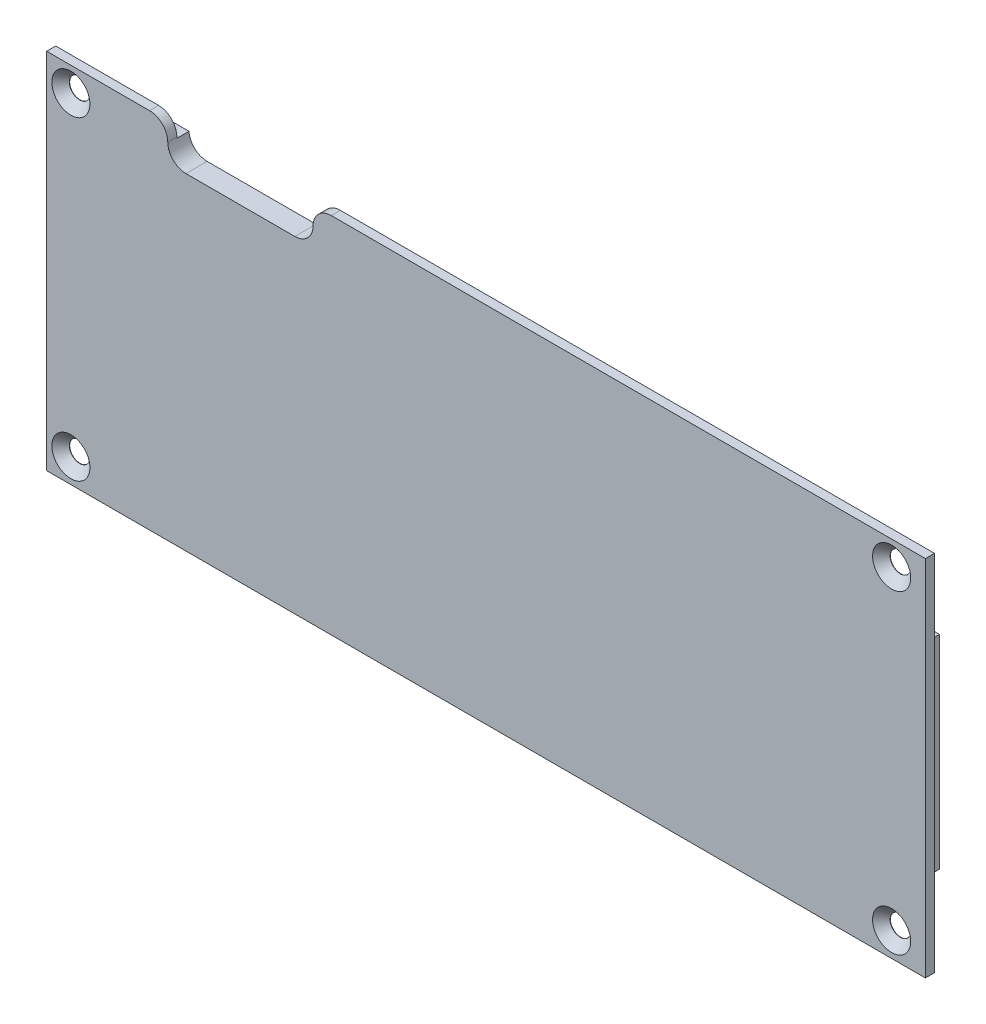
ISO-10303-21;
HEADER;
FILE_DESCRIPTION(('STEP AP214'),'2;1');
FILE_NAME('part.step','',(''),(''),'','','');
FILE_SCHEMA(('AUTOMOTIVE_DESIGN { 1 0 10303 214 1 1 1 1 }'));
ENDSEC;
DATA;
#1=APPLICATION_CONTEXT('core data for automotive mechanical design processes');
#2=APPLICATION_PROTOCOL_DEFINITION('international standard','automotive_design',2000,#1);
#3=PRODUCT_CONTEXT('',#1,'mechanical');
#4=PRODUCT('Part','Part','',(#3));
#5=PRODUCT_RELATED_PRODUCT_CATEGORY('part','',(#4));
#6=PRODUCT_DEFINITION_FORMATION('','',#4);
#7=PRODUCT_DEFINITION_CONTEXT('part definition',#1,'design');
#8=PRODUCT_DEFINITION('design','',#6,#7);
#9=PRODUCT_DEFINITION_SHAPE('','',#8);
#10=(LENGTH_UNIT() NAMED_UNIT(*) SI_UNIT(.MILLI.,.METRE.));
#11=(NAMED_UNIT(*) PLANE_ANGLE_UNIT() SI_UNIT($,.RADIAN.));
#12=(NAMED_UNIT(*) SI_UNIT($,.STERADIAN.) SOLID_ANGLE_UNIT());
#13=UNCERTAINTY_MEASURE_WITH_UNIT(LENGTH_MEASURE(1.E-05),#10,'distance_accuracy_value','');
#14=(GEOMETRIC_REPRESENTATION_CONTEXT(3) GLOBAL_UNCERTAINTY_ASSIGNED_CONTEXT((#13)) GLOBAL_UNIT_ASSIGNED_CONTEXT((#10,
#11,#12)) REPRESENTATION_CONTEXT('',''));
#15=CARTESIAN_POINT('',(0.,0.,0.));
#16=DIRECTION('',(0.,0.,1.));
#17=DIRECTION('',(1.,0.,0.));
#18=AXIS2_PLACEMENT_3D('',#15,#16,#17);
#19=CARTESIAN_POINT('',(72.574098,30.,1.5));
#20=DIRECTION('',(0.,-1.,0.));
#21=DIRECTION('',(1.,0.,0.));
#22=AXIS2_PLACEMENT_3D('',#19,#20,#21);
#23=PLANE('',#22);
#24=DIRECTION('',(-1.,0.,0.));
#25=VECTOR('',#24,1.);
#26=CARTESIAN_POINT('',(72.574098,30.,1.5));
#27=LINE('',#26,#25);
#28=CARTESIAN_POINT('',(-55.574098,30.,1.5));
#29=VERTEX_POINT('',#28);
#30=CARTESIAN_POINT('',(-72.574098,30.,1.5));
#31=VERTEX_POINT('',#30);
#32=EDGE_CURVE('E216',#29,#31,#27,.T.);
#33=ORIENTED_EDGE('',*,*,#32,.F.);
#34=DIRECTION('',(0.,0.,1.));
#35=VECTOR('',#34,1.);
#36=CARTESIAN_POINT('',(-55.574098,30.,1.5));
#37=LINE('',#36,#35);
#38=CARTESIAN_POINT('',(-55.574098,30.,0.));
#39=VERTEX_POINT('',#38);
#40=EDGE_CURVE('E253',#29,#39,#37,.F.);
#41=ORIENTED_EDGE('',*,*,#40,.T.);
#42=DIRECTION('',(-1.,0.,0.));
#43=VECTOR('',#42,1.);
#44=CARTESIAN_POINT('',(72.574098,30.,0.));
#45=LINE('',#44,#43);
#46=CARTESIAN_POINT('',(-72.574098,30.,0.));
#47=VERTEX_POINT('',#46);
#48=EDGE_CURVE('E224',#39,#47,#45,.T.);
#49=ORIENTED_EDGE('',*,*,#48,.T.);
#50=DIRECTION('',(0.,0.,-1.));
#51=VECTOR('',#50,1.);
#52=CARTESIAN_POINT('',(-72.574098,30.,1.5));
#53=LINE('',#52,#51);
#54=EDGE_CURVE('E219',#31,#47,#53,.T.);
#55=ORIENTED_EDGE('',*,*,#54,.F.);
#56=EDGE_LOOP('',(#33,#41,#49,#55));
#57=FACE_BOUND('',#56,.T.);
#58=ADVANCED_FACE('F37',(#57),#23,.F.);
#59=CARTESIAN_POINT('',(61.374098,26.8,-2.));
#60=DIRECTION('',(0.,-1.,0.));
#61=DIRECTION('',(0.,0.,-1.));
#62=AXIS2_PLACEMENT_3D('',#59,#60,#61);
#63=PLANE('',#62);
#64=DIRECTION('',(1.,0.,0.));
#65=VECTOR('',#64,1.);
#66=CARTESIAN_POINT('',(61.374098,26.8,0.));
#67=LINE('',#66,#65);
#68=CARTESIAN_POINT('',(-61.374098,26.8,0.));
#69=VERTEX_POINT('',#68);
#70=CARTESIAN_POINT('',(-52.5674239094191,26.8,0.));
#71=VERTEX_POINT('',#70);
#72=EDGE_CURVE('E60',#69,#71,#67,.T.);
#73=ORIENTED_EDGE('',*,*,#72,.T.);
#74=DIRECTION('',(0.,0.,-1.));
#75=VECTOR('',#74,1.);
#76=CARTESIAN_POINT('',(-52.5674239094192,26.8,0.));
#77=LINE('',#76,#75);
#78=CARTESIAN_POINT('',(-52.5674239094191,26.8,-2.));
#79=VERTEX_POINT('',#78);
#80=EDGE_CURVE('E46',#71,#79,#77,.T.);
#81=ORIENTED_EDGE('',*,*,#80,.T.);
#82=DIRECTION('',(1.,0.,0.));
#83=VECTOR('',#82,1.);
#84=CARTESIAN_POINT('',(61.374098,26.8,-2.));
#85=LINE('',#84,#83);
#86=CARTESIAN_POINT('',(-61.374098,26.8,-2.));
#87=VERTEX_POINT('',#86);
#88=EDGE_CURVE('E53',#87,#79,#85,.T.);
#89=ORIENTED_EDGE('',*,*,#88,.F.);
#90=DIRECTION('',(0.,0.,1.));
#91=VECTOR('',#90,1.);
#92=CARTESIAN_POINT('',(-61.374098,26.8,-2.));
#93=LINE('',#92,#91);
#94=EDGE_CURVE('E394',#87,#69,#93,.T.);
#95=ORIENTED_EDGE('',*,*,#94,.T.);
#96=EDGE_LOOP('',(#73,#81,#89,#95));
#97=FACE_BOUND('',#96,.T.);
#98=ADVANCED_FACE('F410',(#97),#63,.F.);
#99=CARTESIAN_POINT('',(0.,0.,0.));
#100=DIRECTION('',(0.,0.,1.));
#101=DIRECTION('',(1.,0.,0.));
#102=AXIS2_PLACEMENT_3D('',#99,#100,#101);
#103=PLANE('',#102);
#104=CARTESIAN_POINT('',(-68.574098,26.,0.));
#105=DIRECTION('',(0.,0.,1.));
#106=DIRECTION('',(1.,0.,0.));
#107=AXIS2_PLACEMENT_3D('',#104,#105,#106);
#108=CIRCLE('',#107,1.69999999999999);
#109=CARTESIAN_POINT('',(-66.874098,26.,0.));
#110=VERTEX_POINT('',#109);
#111=EDGE_CURVE('E329',#110,#110,#108,.T.);
#112=ORIENTED_EDGE('',*,*,#111,.T.);
#113=EDGE_LOOP('',(#112));
#114=FACE_BOUND('',#113,.T.);
#115=CARTESIAN_POINT('',(-68.574098,-26.,0.));
#116=DIRECTION('',(0.,0.,1.));
#117=DIRECTION('',(1.,0.,0.));
#118=AXIS2_PLACEMENT_3D('',#115,#116,#117);
#119=CIRCLE('',#118,1.69999999999999);
#120=CARTESIAN_POINT('',(-66.874098,-26.,0.));
#121=VERTEX_POINT('',#120);
#122=EDGE_CURVE('E338',#121,#121,#119,.T.);
#123=ORIENTED_EDGE('',*,*,#122,.T.);
#124=EDGE_LOOP('',(#123));
#125=FACE_BOUND('',#124,.T.);
#126=CARTESIAN_POINT('',(66.99808,26.,0.));
#127=DIRECTION('',(0.,0.,1.));
#128=DIRECTION('',(1.,0.,0.));
#129=AXIS2_PLACEMENT_3D('',#126,#127,#128);
#130=CIRCLE('',#129,1.69999999999999);
#131=CARTESIAN_POINT('',(68.69808,26.,0.));
#132=VERTEX_POINT('',#131);
#133=EDGE_CURVE('E347',#132,#132,#130,.T.);
#134=ORIENTED_EDGE('',*,*,#133,.T.);
#135=EDGE_LOOP('',(#134));
#136=FACE_BOUND('',#135,.T.);
#137=CARTESIAN_POINT('',(66.99808,-26.,0.));
#138=DIRECTION('',(0.,0.,1.));
#139=DIRECTION('',(1.,0.,0.));
#140=AXIS2_PLACEMENT_3D('',#137,#138,#139);
#141=CIRCLE('',#140,1.69999999999999);
#142=CARTESIAN_POINT('',(68.69808,-26.,0.));
#143=VERTEX_POINT('',#142);
#144=EDGE_CURVE('E356',#143,#143,#141,.T.);
#145=ORIENTED_EDGE('',*,*,#144,.T.);
#146=EDGE_LOOP('',(#145));
#147=FACE_BOUND('',#146,.T.);
#148=CARTESIAN_POINT('',(-28.5807720905808,26.8,0.));
#149=VERTEX_POINT('',#148);
#150=CARTESIAN_POINT('',(61.374098,26.8,0.));
#151=VERTEX_POINT('',#150);
#152=EDGE_CURVE('E380',#149,#151,#67,.T.);
#153=ORIENTED_EDGE('',*,*,#152,.F.);
#154=CARTESIAN_POINT('',(-31.574098,27.,0.));
#155=DIRECTION('',(0.,0.,1.));
#156=DIRECTION('',(1.,0.,0.));
#157=AXIS2_PLACEMENT_3D('',#154,#155,#156);
#158=CIRCLE('',#157,3.);
#159=CARTESIAN_POINT('',(-28.574098,27.,0.));
#160=VERTEX_POINT('',#159);
#161=EDGE_CURVE('E264',#149,#160,#158,.T.);
#162=ORIENTED_EDGE('',*,*,#161,.T.);
#163=CARTESIAN_POINT('',(-25.574098,27.,0.));
#164=DIRECTION('',(0.,0.,1.));
#165=DIRECTION('',(1.,0.,0.));
#166=AXIS2_PLACEMENT_3D('',#163,#164,#165);
#167=CIRCLE('',#166,3.);
#168=CARTESIAN_POINT('',(-25.574098,30.,0.));
#169=VERTEX_POINT('',#168);
#170=EDGE_CURVE('E247',#160,#169,#167,.F.);
#171=ORIENTED_EDGE('',*,*,#170,.T.);
#172=CARTESIAN_POINT('',(72.574098,30.,0.));
#173=VERTEX_POINT('',#172);
#174=EDGE_CURVE('E212',#173,#169,#45,.T.);
#175=ORIENTED_EDGE('',*,*,#174,.F.);
#176=DIRECTION('',(0.,1.,0.));
#177=VECTOR('',#176,1.);
#178=CARTESIAN_POINT('',(72.574098,-30.,0.));
#179=LINE('',#178,#177);
#180=CARTESIAN_POINT('',(72.574098,-30.,0.));
#181=VERTEX_POINT('',#180);
#182=EDGE_CURVE('E222',#181,#173,#179,.T.);
#183=ORIENTED_EDGE('',*,*,#182,.F.);
#184=DIRECTION('',(1.,0.,0.));
#185=VECTOR('',#184,1.);
#186=CARTESIAN_POINT('',(72.574098,-30.,0.));
#187=LINE('',#186,#185);
#188=CARTESIAN_POINT('',(-72.574098,-30.,0.));
#189=VERTEX_POINT('',#188);
#190=EDGE_CURVE('E202',#189,#181,#187,.T.);
#191=ORIENTED_EDGE('',*,*,#190,.F.);
#192=DIRECTION('',(0.,-1.,0.));
#193=VECTOR('',#192,1.);
#194=CARTESIAN_POINT('',(-72.574098,-30.,0.));
#195=LINE('',#194,#193);
#196=EDGE_CURVE('E199',#47,#189,#195,.T.);
#197=ORIENTED_EDGE('',*,*,#196,.F.);
#198=ORIENTED_EDGE('',*,*,#48,.F.);
#199=CARTESIAN_POINT('',(-55.574098,27.,0.));
#200=DIRECTION('',(0.,0.,1.));
#201=DIRECTION('',(1.,0.,0.));
#202=AXIS2_PLACEMENT_3D('',#199,#200,#201);
#203=CIRCLE('',#202,3.);
#204=CARTESIAN_POINT('',(-52.574098,27.,0.));
#205=VERTEX_POINT('',#204);
#206=EDGE_CURVE('E245',#39,#205,#203,.F.);
#207=ORIENTED_EDGE('',*,*,#206,.T.);
#208=CARTESIAN_POINT('',(-49.574098,27.,0.));
#209=DIRECTION('',(0.,0.,1.));
#210=DIRECTION('',(1.,0.,0.));
#211=AXIS2_PLACEMENT_3D('',#208,#209,#210);
#212=CIRCLE('',#211,3.);
#213=EDGE_CURVE('E268',#205,#71,#212,.T.);
#214=ORIENTED_EDGE('',*,*,#213,.T.);
#215=ORIENTED_EDGE('',*,*,#72,.F.);
#216=CARTESIAN_POINT('',(-71.374098,26.8,0.));
#217=DIRECTION('',(0.,0.,1.));
#218=DIRECTION('',(-1.,0.,0.));
#219=AXIS2_PLACEMENT_3D('',#216,#217,#218);
#220=CIRCLE('',#219,10.);
#221=CARTESIAN_POINT('',(-71.374098,16.8,0.));
#222=VERTEX_POINT('',#221);
#223=EDGE_CURVE('E378',#222,#69,#220,.T.);
#224=ORIENTED_EDGE('',*,*,#223,.F.);
#225=DIRECTION('',(0.,1.,0.));
#226=VECTOR('',#225,1.);
#227=CARTESIAN_POINT('',(-71.374098,16.8,0.));
#228=LINE('',#227,#226);
#229=CARTESIAN_POINT('',(-71.374098,-16.8,0.));
#230=VERTEX_POINT('',#229);
#231=EDGE_CURVE('E375',#230,#222,#228,.T.);
#232=ORIENTED_EDGE('',*,*,#231,.F.);
#233=CARTESIAN_POINT('',(-71.374098,-26.8,0.));
#234=DIRECTION('',(0.,0.,1.));
#235=DIRECTION('',(-1.,0.,0.));
#236=AXIS2_PLACEMENT_3D('',#233,#234,#235);
#237=CIRCLE('',#236,10.);
#238=CARTESIAN_POINT('',(-61.374098,-26.8,0.));
#239=VERTEX_POINT('',#238);
#240=EDGE_CURVE('E372',#239,#230,#237,.T.);
#241=ORIENTED_EDGE('',*,*,#240,.F.);
#242=DIRECTION('',(-1.,0.,0.));
#243=VECTOR('',#242,1.);
#244=CARTESIAN_POINT('',(-61.374098,-26.8,0.));
#245=LINE('',#244,#243);
#246=CARTESIAN_POINT('',(61.374098,-26.8,0.));
#247=VERTEX_POINT('',#246);
#248=EDGE_CURVE('E370',#247,#239,#245,.T.);
#249=ORIENTED_EDGE('',*,*,#248,.F.);
#250=CARTESIAN_POINT('',(71.374098,-26.8,0.));
#251=DIRECTION('',(0.,0.,1.));
#252=DIRECTION('',(1.,0.,0.));
#253=AXIS2_PLACEMENT_3D('',#250,#251,#252);
#254=CIRCLE('',#253,10.);
#255=CARTESIAN_POINT('',(71.374098,-16.8,0.));
#256=VERTEX_POINT('',#255);
#257=EDGE_CURVE('E198',#256,#247,#254,.T.);
#258=ORIENTED_EDGE('',*,*,#257,.F.);
#259=DIRECTION('',(0.,-1.,0.));
#260=VECTOR('',#259,1.);
#261=CARTESIAN_POINT('',(71.374098,-16.8,0.));
#262=LINE('',#261,#260);
#263=CARTESIAN_POINT('',(71.374098,16.8,0.));
#264=VERTEX_POINT('',#263);
#265=EDGE_CURVE('E195',#264,#256,#262,.T.);
#266=ORIENTED_EDGE('',*,*,#265,.F.);
#267=CARTESIAN_POINT('',(71.374098,26.8,0.));
#268=DIRECTION('',(0.,0.,1.));
#269=DIRECTION('',(-1.,0.,0.));
#270=AXIS2_PLACEMENT_3D('',#267,#268,#269);
#271=CIRCLE('',#270,10.);
#272=EDGE_CURVE('E382',#151,#264,#271,.T.);
#273=ORIENTED_EDGE('',*,*,#272,.F.);
#274=EDGE_LOOP('',(#153,#162,#171,#175,#183,#191,#197,#198,#207,#214,#215,#224,#232,#241,#249,
#258,#266,#273));
#275=FACE_BOUND('',#274,.T.);
#276=ADVANCED_FACE('F292',(#114,#125,#136,#147,#275),#103,.F.);
#277=CARTESIAN_POINT('',(-72.574098,-30.,1.5));
#278=DIRECTION('',(1.,0.,0.));
#279=DIRECTION('',(0.,0.,-1.));
#280=AXIS2_PLACEMENT_3D('',#277,#278,#279);
#281=PLANE('',#280);
#282=ORIENTED_EDGE('',*,*,#196,.T.);
#283=DIRECTION('',(0.,0.,-1.));
#284=VECTOR('',#283,1.);
#285=CARTESIAN_POINT('',(-72.574098,-30.,1.5));
#286=LINE('',#285,#284);
#287=CARTESIAN_POINT('',(-72.574098,-30.,1.5));
#288=VERTEX_POINT('',#287);
#289=EDGE_CURVE('E235',#288,#189,#286,.T.);
#290=ORIENTED_EDGE('',*,*,#289,.F.);
#291=DIRECTION('',(0.,-1.,0.));
#292=VECTOR('',#291,1.);
#293=CARTESIAN_POINT('',(-72.574098,-30.,1.5));
#294=LINE('',#293,#292);
#295=EDGE_CURVE('E208',#31,#288,#294,.T.);
#296=ORIENTED_EDGE('',*,*,#295,.F.);
#297=ORIENTED_EDGE('',*,*,#54,.T.);
#298=EDGE_LOOP('',(#282,#290,#296,#297));
#299=FACE_BOUND('',#298,.T.);
#300=ADVANCED_FACE('F301',(#299),#281,.F.);
#301=CARTESIAN_POINT('',(72.574098,-30.,1.5));
#302=DIRECTION('',(0.,1.,0.));
#303=DIRECTION('',(-1.,0.,0.));
#304=AXIS2_PLACEMENT_3D('',#301,#302,#303);
#305=PLANE('',#304);
#306=ORIENTED_EDGE('',*,*,#190,.T.);
#307=DIRECTION('',(0.,0.,-1.));
#308=VECTOR('',#307,1.);
#309=CARTESIAN_POINT('',(72.574098,-30.,1.5));
#310=LINE('',#309,#308);
#311=CARTESIAN_POINT('',(72.574098,-30.,1.5));
#312=VERTEX_POINT('',#311);
#313=EDGE_CURVE('E232',#312,#181,#310,.T.);
#314=ORIENTED_EDGE('',*,*,#313,.F.);
#315=DIRECTION('',(1.,0.,0.));
#316=VECTOR('',#315,1.);
#317=CARTESIAN_POINT('',(72.574098,-30.,1.5));
#318=LINE('',#317,#316);
#319=EDGE_CURVE('E211',#288,#312,#318,.T.);
#320=ORIENTED_EDGE('',*,*,#319,.F.);
#321=ORIENTED_EDGE('',*,*,#289,.T.);
#322=EDGE_LOOP('',(#306,#314,#320,#321));
#323=FACE_BOUND('',#322,.T.);
#324=ADVANCED_FACE('F448',(#323),#305,.F.);
#325=CARTESIAN_POINT('',(72.574098,-30.,1.5));
#326=DIRECTION('',(-1.,0.,0.));
#327=DIRECTION('',(0.,-1.,0.));
#328=AXIS2_PLACEMENT_3D('',#325,#326,#327);
#329=PLANE('',#328);
#330=ORIENTED_EDGE('',*,*,#182,.T.);
#331=DIRECTION('',(0.,0.,-1.));
#332=VECTOR('',#331,1.);
#333=CARTESIAN_POINT('',(72.574098,30.,1.5));
#334=LINE('',#333,#332);
#335=CARTESIAN_POINT('',(72.574098,30.,1.5));
#336=VERTEX_POINT('',#335);
#337=EDGE_CURVE('E229',#336,#173,#334,.T.);
#338=ORIENTED_EDGE('',*,*,#337,.F.);
#339=DIRECTION('',(0.,1.,0.));
#340=VECTOR('',#339,1.);
#341=CARTESIAN_POINT('',(72.574098,-30.,1.5));
#342=LINE('',#341,#340);
#343=EDGE_CURVE('E214',#312,#336,#342,.T.);
#344=ORIENTED_EDGE('',*,*,#343,.F.);
#345=ORIENTED_EDGE('',*,*,#313,.T.);
#346=EDGE_LOOP('',(#330,#338,#344,#345));
#347=FACE_BOUND('',#346,.T.);
#348=ADVANCED_FACE('F445',(#347),#329,.F.);
#349=ORIENTED_EDGE('',*,*,#174,.T.);
#350=DIRECTION('',(0.,0.,1.));
#351=VECTOR('',#350,1.);
#352=CARTESIAN_POINT('',(-25.574098,30.,1.5));
#353=LINE('',#352,#351);
#354=CARTESIAN_POINT('',(-25.574098,30.,1.5));
#355=VERTEX_POINT('',#354);
#356=EDGE_CURVE('E238',#169,#355,#353,.T.);
#357=ORIENTED_EDGE('',*,*,#356,.T.);
#358=EDGE_CURVE('E217',#336,#355,#27,.T.);
#359=ORIENTED_EDGE('',*,*,#358,.F.);
#360=ORIENTED_EDGE('',*,*,#337,.T.);
#361=EDGE_LOOP('',(#349,#357,#359,#360));
#362=FACE_BOUND('',#361,.T.);
#363=ADVANCED_FACE('F421',(#362),#23,.F.);
#364=CARTESIAN_POINT('',(0.,0.,1.5));
#365=DIRECTION('',(0.,0.,1.));
#366=DIRECTION('',(1.,0.,0.));
#367=AXIS2_PLACEMENT_3D('',#364,#365,#366);
#368=PLANE('',#367);
#369=ORIENTED_EDGE('',*,*,#358,.T.);
#370=CARTESIAN_POINT('',(-25.574098,27.,1.5));
#371=DIRECTION('',(0.,0.,1.));
#372=DIRECTION('',(1.,0.,0.));
#373=AXIS2_PLACEMENT_3D('',#370,#371,#372);
#374=CIRCLE('',#373,3.);
#375=CARTESIAN_POINT('',(-28.574098,27.,1.5));
#376=VERTEX_POINT('',#375);
#377=EDGE_CURVE('E243',#355,#376,#374,.T.);
#378=ORIENTED_EDGE('',*,*,#377,.T.);
#379=CARTESIAN_POINT('',(-31.574098,27.,1.5));
#380=DIRECTION('',(0.,0.,1.));
#381=DIRECTION('',(1.,0.,0.));
#382=AXIS2_PLACEMENT_3D('',#379,#380,#381);
#383=CIRCLE('',#382,3.);
#384=CARTESIAN_POINT('',(-31.574098,24.,1.5));
#385=VERTEX_POINT('',#384);
#386=EDGE_CURVE('E256',#376,#385,#383,.F.);
#387=ORIENTED_EDGE('',*,*,#386,.T.);
#388=DIRECTION('',(1.,0.,0.));
#389=VECTOR('',#388,1.);
#390=CARTESIAN_POINT('',(-52.574098,24.,1.5));
#391=LINE('',#390,#389);
#392=CARTESIAN_POINT('',(-49.574098,24.,1.5));
#393=VERTEX_POINT('',#392);
#394=EDGE_CURVE('E272',#393,#385,#391,.T.);
#395=ORIENTED_EDGE('',*,*,#394,.F.);
#396=CARTESIAN_POINT('',(-49.574098,27.,1.5));
#397=DIRECTION('',(0.,0.,1.));
#398=DIRECTION('',(1.,0.,0.));
#399=AXIS2_PLACEMENT_3D('',#396,#397,#398);
#400=CIRCLE('',#399,3.);
#401=CARTESIAN_POINT('',(-52.574098,27.,1.5));
#402=VERTEX_POINT('',#401);
#403=EDGE_CURVE('E266',#393,#402,#400,.F.);
#404=ORIENTED_EDGE('',*,*,#403,.T.);
#405=CARTESIAN_POINT('',(-55.574098,27.,1.5));
#406=DIRECTION('',(0.,0.,1.));
#407=DIRECTION('',(1.,0.,0.));
#408=AXIS2_PLACEMENT_3D('',#405,#406,#407);
#409=CIRCLE('',#408,3.);
#410=EDGE_CURVE('E241',#402,#29,#409,.T.);
#411=ORIENTED_EDGE('',*,*,#410,.T.);
#412=ORIENTED_EDGE('',*,*,#32,.T.);
#413=ORIENTED_EDGE('',*,*,#295,.T.);
#414=ORIENTED_EDGE('',*,*,#319,.T.);
#415=ORIENTED_EDGE('',*,*,#343,.T.);
#416=EDGE_LOOP('',(#369,#378,#387,#395,#404,#411,#412,#413,#414,#415));
#417=FACE_BOUND('',#416,.T.);
#418=CARTESIAN_POINT('',(-68.574098,26.,1.5));
#419=DIRECTION('',(0.,0.,1.));
#420=DIRECTION('',(1.,0.,0.));
#421=AXIS2_PLACEMENT_3D('',#418,#419,#420);
#422=CIRCLE('',#421,3.15);
#423=CARTESIAN_POINT('',(-65.424098,26.,1.5));
#424=VERTEX_POINT('',#423);
#425=EDGE_CURVE('E321',#424,#424,#422,.T.);
#426=ORIENTED_EDGE('',*,*,#425,.F.);
#427=EDGE_LOOP('',(#426));
#428=FACE_BOUND('',#427,.T.);
#429=CARTESIAN_POINT('',(-68.574098,-26.,1.5));
#430=DIRECTION('',(0.,0.,1.));
#431=DIRECTION('',(1.,0.,0.));
#432=AXIS2_PLACEMENT_3D('',#429,#430,#431);
#433=CIRCLE('',#432,3.15);
#434=CARTESIAN_POINT('',(-65.424098,-26.,1.5));
#435=VERTEX_POINT('',#434);
#436=EDGE_CURVE('E332',#435,#435,#433,.T.);
#437=ORIENTED_EDGE('',*,*,#436,.F.);
#438=EDGE_LOOP('',(#437));
#439=FACE_BOUND('',#438,.T.);
#440=CARTESIAN_POINT('',(66.99808,26.,1.5));
#441=DIRECTION('',(0.,0.,1.));
#442=DIRECTION('',(1.,0.,0.));
#443=AXIS2_PLACEMENT_3D('',#440,#441,#442);
#444=CIRCLE('',#443,3.15);
#445=CARTESIAN_POINT('',(70.14808,26.,1.5));
#446=VERTEX_POINT('',#445);
#447=EDGE_CURVE('E341',#446,#446,#444,.T.);
#448=ORIENTED_EDGE('',*,*,#447,.F.);
#449=EDGE_LOOP('',(#448));
#450=FACE_BOUND('',#449,.T.);
#451=CARTESIAN_POINT('',(66.99808,-26.,1.5));
#452=DIRECTION('',(0.,0.,1.));
#453=DIRECTION('',(1.,0.,0.));
#454=AXIS2_PLACEMENT_3D('',#451,#452,#453);
#455=CIRCLE('',#454,3.15);
#456=CARTESIAN_POINT('',(70.14808,-26.,1.5));
#457=VERTEX_POINT('',#456);
#458=EDGE_CURVE('E350',#457,#457,#455,.T.);
#459=ORIENTED_EDGE('',*,*,#458,.F.);
#460=EDGE_LOOP('',(#459));
#461=FACE_BOUND('',#460,.T.);
#462=ADVANCED_FACE('F304',(#417,#428,#439,#450,#461),#368,.T.);
#463=CARTESIAN_POINT('',(71.374098,-26.8,-2.));
#464=DIRECTION('',(0.,0.,1.));
#465=DIRECTION('',(1.,0.,0.));
#466=AXIS2_PLACEMENT_3D('',#463,#464,#465);
#467=CYLINDRICAL_SURFACE('',#466,10.);
#468=ORIENTED_EDGE('',*,*,#257,.T.);
#469=DIRECTION('',(0.,0.,1.));
#470=VECTOR('',#469,1.);
#471=CARTESIAN_POINT('',(61.374098,-26.8,-2.));
#472=LINE('',#471,#470);
#473=CARTESIAN_POINT('',(61.374098,-26.8,-2.));
#474=VERTEX_POINT('',#473);
#475=EDGE_CURVE('E180',#474,#247,#472,.T.);
#476=ORIENTED_EDGE('',*,*,#475,.F.);
#477=CARTESIAN_POINT('',(71.374098,-26.8,-2.));
#478=DIRECTION('',(0.,0.,1.));
#479=DIRECTION('',(1.,0.,0.));
#480=AXIS2_PLACEMENT_3D('',#477,#478,#479);
#481=CIRCLE('',#480,10.);
#482=CARTESIAN_POINT('',(71.374098,-16.8,-2.));
#483=VERTEX_POINT('',#482);
#484=EDGE_CURVE('E186',#483,#474,#481,.T.);
#485=ORIENTED_EDGE('',*,*,#484,.F.);
#486=DIRECTION('',(0.,0.,1.));
#487=VECTOR('',#486,1.);
#488=CARTESIAN_POINT('',(71.374098,-16.8,-2.));
#489=LINE('',#488,#487);
#490=EDGE_CURVE('E368',#483,#256,#489,.T.);
#491=ORIENTED_EDGE('',*,*,#490,.T.);
#492=EDGE_LOOP('',(#468,#476,#485,#491));
#493=FACE_BOUND('',#492,.T.);
#494=ADVANCED_FACE('F197',(#493),#467,.F.);
#495=CARTESIAN_POINT('',(-61.374098,-26.8,-2.));
#496=DIRECTION('',(0.,1.,0.));
#497=DIRECTION('',(0.,0.,1.));
#498=AXIS2_PLACEMENT_3D('',#495,#496,#497);
#499=PLANE('',#498);
#500=ORIENTED_EDGE('',*,*,#248,.T.);
#501=DIRECTION('',(0.,0.,1.));
#502=VECTOR('',#501,1.);
#503=CARTESIAN_POINT('',(-61.374098,-26.8,-2.));
#504=LINE('',#503,#502);
#505=CARTESIAN_POINT('',(-61.374098,-26.8,-2.));
#506=VERTEX_POINT('',#505);
#507=EDGE_CURVE('E183',#506,#239,#504,.T.);
#508=ORIENTED_EDGE('',*,*,#507,.F.);
#509=DIRECTION('',(-1.,0.,0.));
#510=VECTOR('',#509,1.);
#511=CARTESIAN_POINT('',(-61.374098,-26.8,-2.));
#512=LINE('',#511,#510);
#513=EDGE_CURVE('E175',#474,#506,#512,.T.);
#514=ORIENTED_EDGE('',*,*,#513,.F.);
#515=ORIENTED_EDGE('',*,*,#475,.T.);
#516=EDGE_LOOP('',(#500,#508,#514,#515));
#517=FACE_BOUND('',#516,.T.);
#518=ADVANCED_FACE('F178',(#517),#499,.F.);
#519=CARTESIAN_POINT('',(-71.374098,-26.8,-2.));
#520=DIRECTION('',(0.,0.,1.));
#521=DIRECTION('',(1.,0.,0.));
#522=AXIS2_PLACEMENT_3D('',#519,#520,#521);
#523=CYLINDRICAL_SURFACE('',#522,10.);
#524=ORIENTED_EDGE('',*,*,#240,.T.);
#525=DIRECTION('',(0.,0.,1.));
#526=VECTOR('',#525,1.);
#527=CARTESIAN_POINT('',(-71.374098,-16.8,-2.));
#528=LINE('',#527,#526);
#529=CARTESIAN_POINT('',(-71.374098,-16.8,-2.));
#530=VERTEX_POINT('',#529);
#531=EDGE_CURVE('E204',#530,#230,#528,.T.);
#532=ORIENTED_EDGE('',*,*,#531,.F.);
#533=CARTESIAN_POINT('',(-71.374098,-26.8,-2.));
#534=DIRECTION('',(0.,0.,1.));
#535=DIRECTION('',(-1.,0.,0.));
#536=AXIS2_PLACEMENT_3D('',#533,#534,#535);
#537=CIRCLE('',#536,10.);
#538=EDGE_CURVE('E185',#506,#530,#537,.T.);
#539=ORIENTED_EDGE('',*,*,#538,.F.);
#540=ORIENTED_EDGE('',*,*,#507,.T.);
#541=EDGE_LOOP('',(#524,#532,#539,#540));
#542=FACE_BOUND('',#541,.T.);
#543=ADVANCED_FACE('F405',(#542),#523,.F.);
#544=CARTESIAN_POINT('',(-71.374098,16.8,-2.));
#545=DIRECTION('',(1.,0.,0.));
#546=DIRECTION('',(0.,0.,-1.));
#547=AXIS2_PLACEMENT_3D('',#544,#545,#546);
#548=PLANE('',#547);
#549=ORIENTED_EDGE('',*,*,#231,.T.);
#550=DIRECTION('',(0.,0.,1.));
#551=VECTOR('',#550,1.);
#552=CARTESIAN_POINT('',(-71.374098,16.8,-2.));
#553=LINE('',#552,#551);
#554=CARTESIAN_POINT('',(-71.374098,16.8,-2.));
#555=VERTEX_POINT('',#554);
#556=EDGE_CURVE('E396',#555,#222,#553,.T.);
#557=ORIENTED_EDGE('',*,*,#556,.F.);
#558=DIRECTION('',(0.,1.,0.));
#559=VECTOR('',#558,1.);
#560=CARTESIAN_POINT('',(-71.374098,16.8,-2.));
#561=LINE('',#560,#559);
#562=EDGE_CURVE('E360',#530,#555,#561,.T.);
#563=ORIENTED_EDGE('',*,*,#562,.F.);
#564=ORIENTED_EDGE('',*,*,#531,.T.);
#565=EDGE_LOOP('',(#549,#557,#563,#564));
#566=FACE_BOUND('',#565,.T.);
#567=ADVANCED_FACE('F402',(#566),#548,.F.);
#568=CARTESIAN_POINT('',(-71.374098,26.8,-2.));
#569=DIRECTION('',(0.,0.,1.));
#570=DIRECTION('',(1.,0.,0.));
#571=AXIS2_PLACEMENT_3D('',#568,#569,#570);
#572=CYLINDRICAL_SURFACE('',#571,10.);
#573=ORIENTED_EDGE('',*,*,#223,.T.);
#574=ORIENTED_EDGE('',*,*,#94,.F.);
#575=CARTESIAN_POINT('',(-71.374098,26.8,-2.));
#576=DIRECTION('',(0.,0.,1.));
#577=DIRECTION('',(-1.,0.,0.));
#578=AXIS2_PLACEMENT_3D('',#575,#576,#577);
#579=CIRCLE('',#578,10.);
#580=EDGE_CURVE('E362',#555,#87,#579,.T.);
#581=ORIENTED_EDGE('',*,*,#580,.F.);
#582=ORIENTED_EDGE('',*,*,#556,.T.);
#583=EDGE_LOOP('',(#573,#574,#581,#582));
#584=FACE_BOUND('',#583,.T.);
#585=ADVANCED_FACE('F408',(#584),#572,.F.);
#586=CARTESIAN_POINT('',(-28.5807720905808,26.8,-2.));
#587=VERTEX_POINT('',#586);
#588=CARTESIAN_POINT('',(61.374098,26.8,-2.));
#589=VERTEX_POINT('',#588);
#590=EDGE_CURVE('E319',#587,#589,#85,.T.);
#591=ORIENTED_EDGE('',*,*,#590,.F.);
#592=DIRECTION('',(0.,0.,-1.));
#593=VECTOR('',#592,1.);
#594=CARTESIAN_POINT('',(-28.5807720905809,26.8,-2.));
#595=LINE('',#594,#593);
#596=EDGE_CURVE('E261',#587,#149,#595,.F.);
#597=ORIENTED_EDGE('',*,*,#596,.T.);
#598=ORIENTED_EDGE('',*,*,#152,.T.);
#599=DIRECTION('',(0.,0.,1.));
#600=VECTOR('',#599,1.);
#601=CARTESIAN_POINT('',(61.374098,26.8,-2.));
#602=LINE('',#601,#600);
#603=EDGE_CURVE('E391',#589,#151,#602,.T.);
#604=ORIENTED_EDGE('',*,*,#603,.F.);
#605=EDGE_LOOP('',(#591,#597,#598,#604));
#606=FACE_BOUND('',#605,.T.);
#607=ADVANCED_FACE('F413',(#606),#63,.F.);
#608=CARTESIAN_POINT('',(71.374098,26.8,-2.));
#609=DIRECTION('',(0.,0.,1.));
#610=DIRECTION('',(1.,0.,0.));
#611=AXIS2_PLACEMENT_3D('',#608,#609,#610);
#612=CYLINDRICAL_SURFACE('',#611,10.);
#613=ORIENTED_EDGE('',*,*,#272,.T.);
#614=DIRECTION('',(0.,0.,1.));
#615=VECTOR('',#614,1.);
#616=CARTESIAN_POINT('',(71.374098,16.8,-2.));
#617=LINE('',#616,#615);
#618=CARTESIAN_POINT('',(71.374098,16.8,-2.));
#619=VERTEX_POINT('',#618);
#620=EDGE_CURVE('E388',#619,#264,#617,.T.);
#621=ORIENTED_EDGE('',*,*,#620,.F.);
#622=CARTESIAN_POINT('',(71.374098,26.8,-2.));
#623=DIRECTION('',(0.,0.,1.));
#624=DIRECTION('',(-1.,0.,0.));
#625=AXIS2_PLACEMENT_3D('',#622,#623,#624);
#626=CIRCLE('',#625,10.);
#627=EDGE_CURVE('E365',#589,#619,#626,.T.);
#628=ORIENTED_EDGE('',*,*,#627,.F.);
#629=ORIENTED_EDGE('',*,*,#603,.T.);
#630=EDGE_LOOP('',(#613,#621,#628,#629));
#631=FACE_BOUND('',#630,.T.);
#632=ADVANCED_FACE('F425',(#631),#612,.F.);
#633=CARTESIAN_POINT('',(71.374098,-16.8,-2.));
#634=DIRECTION('',(-1.,0.,0.));
#635=DIRECTION('',(0.,0.,1.));
#636=AXIS2_PLACEMENT_3D('',#633,#634,#635);
#637=PLANE('',#636);
#638=ORIENTED_EDGE('',*,*,#265,.T.);
#639=ORIENTED_EDGE('',*,*,#490,.F.);
#640=DIRECTION('',(0.,-1.,0.));
#641=VECTOR('',#640,1.);
#642=CARTESIAN_POINT('',(71.374098,-16.8,-2.));
#643=LINE('',#642,#641);
#644=EDGE_CURVE('E191',#619,#483,#643,.T.);
#645=ORIENTED_EDGE('',*,*,#644,.F.);
#646=ORIENTED_EDGE('',*,*,#620,.T.);
#647=EDGE_LOOP('',(#638,#639,#645,#646));
#648=FACE_BOUND('',#647,.T.);
#649=ADVANCED_FACE('F431',(#648),#637,.F.);
#650=CARTESIAN_POINT('',(71.374098,-26.8,-2.));
#651=DIRECTION('',(0.,0.,1.));
#652=DIRECTION('',(1.,0.,0.));
#653=AXIS2_PLACEMENT_3D('',#650,#651,#652);
#654=PLANE('',#653);
#655=ORIENTED_EDGE('',*,*,#88,.T.);
#656=CARTESIAN_POINT('',(-49.574098,27.,-2.));
#657=DIRECTION('',(0.,0.,1.));
#658=DIRECTION('',(1.,0.,0.));
#659=AXIS2_PLACEMENT_3D('',#656,#657,#658);
#660=CIRCLE('',#659,3.);
#661=CARTESIAN_POINT('',(-49.574098,24.,-2.));
#662=VERTEX_POINT('',#661);
#663=EDGE_CURVE('E11',#79,#662,#660,.T.);
#664=ORIENTED_EDGE('',*,*,#663,.T.);
#665=DIRECTION('',(1.,0.,0.));
#666=VECTOR('',#665,1.);
#667=CARTESIAN_POINT('',(-52.574098,24.,-2.));
#668=LINE('',#667,#666);
#669=CARTESIAN_POINT('',(-31.574098,24.,-2.));
#670=VERTEX_POINT('',#669);
#671=EDGE_CURVE('E277',#662,#670,#668,.T.);
#672=ORIENTED_EDGE('',*,*,#671,.T.);
#673=CARTESIAN_POINT('',(-31.574098,27.,-2.));
#674=DIRECTION('',(0.,0.,1.));
#675=DIRECTION('',(1.,0.,0.));
#676=AXIS2_PLACEMENT_3D('',#673,#674,#675);
#677=CIRCLE('',#676,3.);
#678=EDGE_CURVE('E258',#670,#587,#677,.T.);
#679=ORIENTED_EDGE('',*,*,#678,.T.);
#680=ORIENTED_EDGE('',*,*,#590,.T.);
#681=ORIENTED_EDGE('',*,*,#627,.T.);
#682=ORIENTED_EDGE('',*,*,#644,.T.);
#683=ORIENTED_EDGE('',*,*,#484,.T.);
#684=ORIENTED_EDGE('',*,*,#513,.T.);
#685=ORIENTED_EDGE('',*,*,#538,.T.);
#686=ORIENTED_EDGE('',*,*,#562,.T.);
#687=ORIENTED_EDGE('',*,*,#580,.T.);
#688=EDGE_LOOP('',(#655,#664,#672,#679,#680,#681,#682,#683,#684,#685,#686,#687));
#689=FACE_BOUND('',#688,.T.);
#690=ADVANCED_FACE('F189',(#689),#654,.F.);
#691=CARTESIAN_POINT('',(66.99808,-26.,1.5));
#692=DIRECTION('',(0.,0.,1.));
#693=DIRECTION('',(1.,0.,0.));
#694=AXIS2_PLACEMENT_3D('',#691,#692,#693);
#695=CYLINDRICAL_SURFACE('',#694,1.69999999999999);
#696=ORIENTED_EDGE('',*,*,#144,.F.);
#697=EDGE_LOOP('',(#696));
#698=FACE_BOUND('',#697,.T.);
#699=CARTESIAN_POINT('',(66.99808,-26.,0.0500000000000006));
#700=DIRECTION('',(0.,0.,1.));
#701=DIRECTION('',(1.,0.,0.));
#702=AXIS2_PLACEMENT_3D('',#699,#700,#701);
#703=CIRCLE('',#702,1.69999999999999);
#704=CARTESIAN_POINT('',(68.69808,-26.,0.0500000000000006));
#705=VERTEX_POINT('',#704);
#706=EDGE_CURVE('E353',#705,#705,#703,.T.);
#707=ORIENTED_EDGE('',*,*,#706,.T.);
#708=EDGE_LOOP('',(#707));
#709=FACE_BOUND('',#708,.T.);
#710=ADVANCED_FACE('F538',(#698,#709),#695,.F.);
#711=CARTESIAN_POINT('',(66.99808,-26.,1.5));
#712=DIRECTION('',(0.,0.,1.));
#713=DIRECTION('',(1.,0.,0.));
#714=AXIS2_PLACEMENT_3D('',#711,#712,#713);
#715=CONICAL_SURFACE('',#714,3.15,0.78539816339745);
#716=ORIENTED_EDGE('',*,*,#706,.F.);
#717=EDGE_LOOP('',(#716));
#718=FACE_BOUND('',#717,.T.);
#719=ORIENTED_EDGE('',*,*,#458,.T.);
#720=EDGE_LOOP('',(#719));
#721=FACE_BOUND('',#720,.T.);
#722=ADVANCED_FACE('F530',(#718,#721),#715,.F.);
#723=CARTESIAN_POINT('',(66.99808,26.,1.5));
#724=DIRECTION('',(0.,0.,1.));
#725=DIRECTION('',(1.,0.,0.));
#726=AXIS2_PLACEMENT_3D('',#723,#724,#725);
#727=CYLINDRICAL_SURFACE('',#726,1.69999999999999);
#728=ORIENTED_EDGE('',*,*,#133,.F.);
#729=EDGE_LOOP('',(#728));
#730=FACE_BOUND('',#729,.T.);
#731=CARTESIAN_POINT('',(66.99808,26.,0.0500000000000006));
#732=DIRECTION('',(0.,0.,1.));
#733=DIRECTION('',(1.,0.,0.));
#734=AXIS2_PLACEMENT_3D('',#731,#732,#733);
#735=CIRCLE('',#734,1.69999999999999);
#736=CARTESIAN_POINT('',(68.69808,26.,0.0500000000000006));
#737=VERTEX_POINT('',#736);
#738=EDGE_CURVE('E344',#737,#737,#735,.T.);
#739=ORIENTED_EDGE('',*,*,#738,.T.);
#740=EDGE_LOOP('',(#739));
#741=FACE_BOUND('',#740,.T.);
#742=ADVANCED_FACE('F522',(#730,#741),#727,.F.);
#743=CARTESIAN_POINT('',(66.99808,26.,1.5));
#744=DIRECTION('',(0.,0.,1.));
#745=DIRECTION('',(1.,0.,0.));
#746=AXIS2_PLACEMENT_3D('',#743,#744,#745);
#747=CONICAL_SURFACE('',#746,3.15,0.78539816339745);
#748=ORIENTED_EDGE('',*,*,#738,.F.);
#749=EDGE_LOOP('',(#748));
#750=FACE_BOUND('',#749,.T.);
#751=ORIENTED_EDGE('',*,*,#447,.T.);
#752=EDGE_LOOP('',(#751));
#753=FACE_BOUND('',#752,.T.);
#754=ADVANCED_FACE('F514',(#750,#753),#747,.F.);
#755=CARTESIAN_POINT('',(-68.574098,-26.,1.5));
#756=DIRECTION('',(0.,0.,1.));
#757=DIRECTION('',(1.,0.,0.));
#758=AXIS2_PLACEMENT_3D('',#755,#756,#757);
#759=CYLINDRICAL_SURFACE('',#758,1.69999999999999);
#760=ORIENTED_EDGE('',*,*,#122,.F.);
#761=EDGE_LOOP('',(#760));
#762=FACE_BOUND('',#761,.T.);
#763=CARTESIAN_POINT('',(-68.574098,-26.,0.0500000000000006));
#764=DIRECTION('',(0.,0.,1.));
#765=DIRECTION('',(1.,0.,0.));
#766=AXIS2_PLACEMENT_3D('',#763,#764,#765);
#767=CIRCLE('',#766,1.69999999999999);
#768=CARTESIAN_POINT('',(-66.874098,-26.,0.0500000000000006));
#769=VERTEX_POINT('',#768);
#770=EDGE_CURVE('E335',#769,#769,#767,.T.);
#771=ORIENTED_EDGE('',*,*,#770,.T.);
#772=EDGE_LOOP('',(#771));
#773=FACE_BOUND('',#772,.T.);
#774=ADVANCED_FACE('F506',(#762,#773),#759,.F.);
#775=CARTESIAN_POINT('',(-68.574098,-26.,1.5));
#776=DIRECTION('',(0.,0.,1.));
#777=DIRECTION('',(1.,0.,0.));
#778=AXIS2_PLACEMENT_3D('',#775,#776,#777);
#779=CONICAL_SURFACE('',#778,3.15,0.78539816339745);
#780=ORIENTED_EDGE('',*,*,#770,.F.);
#781=EDGE_LOOP('',(#780));
#782=FACE_BOUND('',#781,.T.);
#783=ORIENTED_EDGE('',*,*,#436,.T.);
#784=EDGE_LOOP('',(#783));
#785=FACE_BOUND('',#784,.T.);
#786=ADVANCED_FACE('F498',(#782,#785),#779,.F.);
#787=CARTESIAN_POINT('',(-68.574098,26.,1.5));
#788=DIRECTION('',(0.,0.,1.));
#789=DIRECTION('',(1.,0.,0.));
#790=AXIS2_PLACEMENT_3D('',#787,#788,#789);
#791=CYLINDRICAL_SURFACE('',#790,1.69999999999999);
#792=ORIENTED_EDGE('',*,*,#111,.F.);
#793=EDGE_LOOP('',(#792));
#794=FACE_BOUND('',#793,.T.);
#795=CARTESIAN_POINT('',(-68.574098,26.,0.0500000000000006));
#796=DIRECTION('',(0.,0.,1.));
#797=DIRECTION('',(1.,0.,0.));
#798=AXIS2_PLACEMENT_3D('',#795,#796,#797);
#799=CIRCLE('',#798,1.69999999999999);
#800=CARTESIAN_POINT('',(-66.874098,26.,0.0500000000000006));
#801=VERTEX_POINT('',#800);
#802=EDGE_CURVE('E324',#801,#801,#799,.T.);
#803=ORIENTED_EDGE('',*,*,#802,.T.);
#804=EDGE_LOOP('',(#803));
#805=FACE_BOUND('',#804,.T.);
#806=ADVANCED_FACE('F489',(#794,#805),#791,.F.);
#807=CARTESIAN_POINT('',(-68.574098,26.,1.5));
#808=DIRECTION('',(0.,0.,1.));
#809=DIRECTION('',(1.,0.,0.));
#810=AXIS2_PLACEMENT_3D('',#807,#808,#809);
#811=CONICAL_SURFACE('',#810,3.15,0.78539816339745);
#812=ORIENTED_EDGE('',*,*,#802,.F.);
#813=EDGE_LOOP('',(#812));
#814=FACE_BOUND('',#813,.T.);
#815=ORIENTED_EDGE('',*,*,#425,.T.);
#816=EDGE_LOOP('',(#815));
#817=FACE_BOUND('',#816,.T.);
#818=ADVANCED_FACE('F481',(#814,#817),#811,.F.);
#819=CARTESIAN_POINT('',(-52.574098,24.,-2.));
#820=DIRECTION('',(0.,-1.,0.));
#821=DIRECTION('',(0.,0.,-1.));
#822=AXIS2_PLACEMENT_3D('',#819,#820,#821);
#823=PLANE('',#822);
#824=ORIENTED_EDGE('',*,*,#394,.T.);
#825=DIRECTION('',(0.,0.,1.));
#826=VECTOR('',#825,1.);
#827=CARTESIAN_POINT('',(-31.574098,24.,-2.));
#828=LINE('',#827,#826);
#829=EDGE_CURVE('E251',#385,#670,#828,.F.);
#830=ORIENTED_EDGE('',*,*,#829,.T.);
#831=ORIENTED_EDGE('',*,*,#671,.F.);
#832=DIRECTION('',(0.,0.,1.));
#833=VECTOR('',#832,1.);
#834=CARTESIAN_POINT('',(-49.574098,24.,1.5));
#835=LINE('',#834,#833);
#836=EDGE_CURVE('E249',#662,#393,#835,.T.);
#837=ORIENTED_EDGE('',*,*,#836,.T.);
#838=EDGE_LOOP('',(#824,#830,#831,#837));
#839=FACE_BOUND('',#838,.T.);
#840=ADVANCED_FACE('F311',(#839),#823,.F.);
#841=CARTESIAN_POINT('',(-31.574098,27.,-2.));
#842=DIRECTION('',(0.,0.,-1.));
#843=DIRECTION('',(-1.,0.,0.));
#844=AXIS2_PLACEMENT_3D('',#841,#842,#843);
#845=CYLINDRICAL_SURFACE('',#844,3.);
#846=DIRECTION('',(0.,0.,1.));
#847=VECTOR('',#846,1.);
#848=CARTESIAN_POINT('',(-28.574098,27.,1.5));
#849=LINE('',#848,#847);
#850=EDGE_CURVE('E270',#160,#376,#849,.T.);
#851=ORIENTED_EDGE('',*,*,#850,.F.);
#852=ORIENTED_EDGE('',*,*,#161,.F.);
#853=ORIENTED_EDGE('',*,*,#596,.F.);
#854=ORIENTED_EDGE('',*,*,#678,.F.);
#855=ORIENTED_EDGE('',*,*,#829,.F.);
#856=ORIENTED_EDGE('',*,*,#386,.F.);
#857=EDGE_LOOP('',(#851,#852,#853,#854,#855,#856));
#858=FACE_BOUND('',#857,.T.);
#859=ADVANCED_FACE('F316',(#858),#845,.F.);
#860=CARTESIAN_POINT('',(-25.574098,27.,1.5));
#861=DIRECTION('',(0.,0.,1.));
#862=DIRECTION('',(1.,0.,0.));
#863=AXIS2_PLACEMENT_3D('',#860,#861,#862);
#864=CYLINDRICAL_SURFACE('',#863,3.);
#865=ORIENTED_EDGE('',*,*,#170,.F.);
#866=ORIENTED_EDGE('',*,*,#850,.T.);
#867=ORIENTED_EDGE('',*,*,#377,.F.);
#868=ORIENTED_EDGE('',*,*,#356,.F.);
#869=EDGE_LOOP('',(#865,#866,#867,#868));
#870=FACE_BOUND('',#869,.T.);
#871=ADVANCED_FACE('F439',(#870),#864,.T.);
#872=CARTESIAN_POINT('',(-49.574098,27.,-2.));
#873=DIRECTION('',(0.,0.,-1.));
#874=DIRECTION('',(-1.,0.,0.));
#875=AXIS2_PLACEMENT_3D('',#872,#873,#874);
#876=CYLINDRICAL_SURFACE('',#875,3.);
#877=ORIENTED_EDGE('',*,*,#80,.F.);
#878=ORIENTED_EDGE('',*,*,#213,.F.);
#879=DIRECTION('',(0.,0.,1.));
#880=VECTOR('',#879,1.);
#881=CARTESIAN_POINT('',(-52.574098,27.,-2.));
#882=LINE('',#881,#880);
#883=EDGE_CURVE('E41',#402,#205,#882,.F.);
#884=ORIENTED_EDGE('',*,*,#883,.F.);
#885=ORIENTED_EDGE('',*,*,#403,.F.);
#886=ORIENTED_EDGE('',*,*,#836,.F.);
#887=ORIENTED_EDGE('',*,*,#663,.F.);
#888=EDGE_LOOP('',(#877,#878,#884,#885,#886,#887));
#889=FACE_BOUND('',#888,.T.);
#890=ADVANCED_FACE('F39',(#889),#876,.F.);
#891=CARTESIAN_POINT('',(-55.574098,27.,-2.));
#892=DIRECTION('',(0.,0.,1.));
#893=DIRECTION('',(1.,0.,0.));
#894=AXIS2_PLACEMENT_3D('',#891,#892,#893);
#895=CYLINDRICAL_SURFACE('',#894,3.);
#896=ORIENTED_EDGE('',*,*,#206,.F.);
#897=ORIENTED_EDGE('',*,*,#40,.F.);
#898=ORIENTED_EDGE('',*,*,#410,.F.);
#899=ORIENTED_EDGE('',*,*,#883,.T.);
#900=EDGE_LOOP('',(#896,#897,#898,#899));
#901=FACE_BOUND('',#900,.T.);
#902=ADVANCED_FACE('F283',(#901),#895,.T.);
#903=CLOSED_SHELL('',(#58,#98,#276,#300,#324,#348,#363,#462,#494,#518,#543,#567,#585,#607,#632,
#649,#690,#710,#722,#742,#754,#774,#786,#806,#818,#840,#859,#871,#890,#902));
#904=MANIFOLD_SOLID_BREP('B2',#903);
#905=ADVANCED_BREP_SHAPE_REPRESENTATION('',(#18,#904),#14);
#906=SHAPE_DEFINITION_REPRESENTATION(#9,#905);
ENDSEC;
END-ISO-10303-21;
